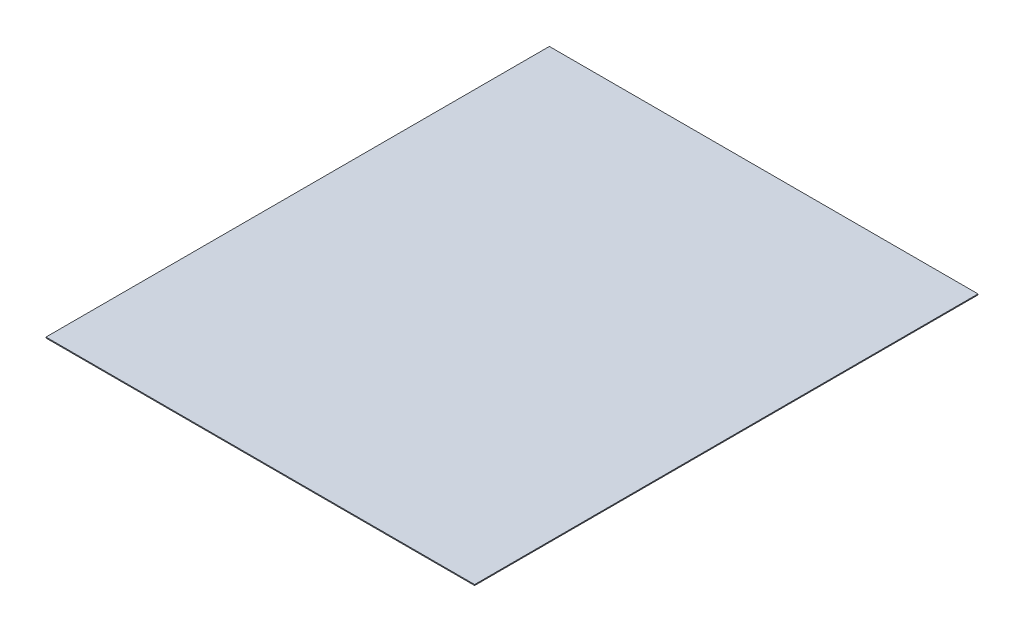
ISO-10303-21;
HEADER;
FILE_DESCRIPTION(('STEP AP214'),'2;1');
FILE_NAME('part.step','',(''),(''),'','','');
FILE_SCHEMA(('AUTOMOTIVE_DESIGN { 1 0 10303 214 1 1 1 1 }'));
ENDSEC;
DATA;
#1=APPLICATION_CONTEXT('core data for automotive mechanical design processes');
#2=APPLICATION_PROTOCOL_DEFINITION('international standard','automotive_design',2000,#1);
#3=PRODUCT_CONTEXT('',#1,'mechanical');
#4=PRODUCT('Part','Part','',(#3));
#5=PRODUCT_RELATED_PRODUCT_CATEGORY('part','',(#4));
#6=PRODUCT_DEFINITION_FORMATION('','',#4);
#7=PRODUCT_DEFINITION_CONTEXT('part definition',#1,'design');
#8=PRODUCT_DEFINITION('design','',#6,#7);
#9=PRODUCT_DEFINITION_SHAPE('','',#8);
#10=(LENGTH_UNIT() NAMED_UNIT(*) SI_UNIT(.MILLI.,.METRE.));
#11=(NAMED_UNIT(*) PLANE_ANGLE_UNIT() SI_UNIT($,.RADIAN.));
#12=(NAMED_UNIT(*) SI_UNIT($,.STERADIAN.) SOLID_ANGLE_UNIT());
#13=UNCERTAINTY_MEASURE_WITH_UNIT(LENGTH_MEASURE(1.E-05),#10,'distance_accuracy_value','');
#14=(GEOMETRIC_REPRESENTATION_CONTEXT(3) GLOBAL_UNCERTAINTY_ASSIGNED_CONTEXT((#13)) GLOBAL_UNIT_ASSIGNED_CONTEXT((#10,
#11,#12)) REPRESENTATION_CONTEXT('',''));
#15=CARTESIAN_POINT('',(0.,0.,0.));
#16=DIRECTION('',(0.,0.,1.));
#17=DIRECTION('',(1.,0.,0.));
#18=AXIS2_PLACEMENT_3D('',#15,#16,#17);
#19=CARTESIAN_POINT('',(1.5,120.,-818.5));
#20=DIRECTION('',(-1.,0.,0.));
#21=DIRECTION('',(0.,0.,1.));
#22=AXIS2_PLACEMENT_3D('',#19,#20,#21);
#23=PLANE('',#22);
#24=DIRECTION('',(0.,-1.,0.));
#25=VECTOR('',#24,1.);
#26=CARTESIAN_POINT('',(1.5,120.,0.));
#27=LINE('',#26,#25);
#28=CARTESIAN_POINT('',(1.5,121.5,0.));
#29=VERTEX_POINT('',#28);
#30=CARTESIAN_POINT('',(1.5,120.,0.));
#31=VERTEX_POINT('',#30);
#32=EDGE_CURVE('E103',#29,#31,#27,.T.);
#33=ORIENTED_EDGE('',*,*,#32,.F.);
#34=DIRECTION('',(0.,0.,1.));
#35=VECTOR('',#34,1.);
#36=CARTESIAN_POINT('',(1.5,121.5,-818.5));
#37=LINE('',#36,#35);
#38=CARTESIAN_POINT('',(1.5,121.5,-818.5));
#39=VERTEX_POINT('',#38);
#40=EDGE_CURVE('E11',#39,#29,#37,.T.);
#41=ORIENTED_EDGE('',*,*,#40,.F.);
#42=DIRECTION('',(0.,-1.,0.));
#43=VECTOR('',#42,1.);
#44=CARTESIAN_POINT('',(1.5,120.,-818.5));
#45=LINE('',#44,#43);
#46=CARTESIAN_POINT('',(1.5,120.,-818.5));
#47=VERTEX_POINT('',#46);
#48=EDGE_CURVE('E97',#39,#47,#45,.T.);
#49=ORIENTED_EDGE('',*,*,#48,.T.);
#50=DIRECTION('',(0.,0.,1.));
#51=VECTOR('',#50,1.);
#52=CARTESIAN_POINT('',(1.5,120.,-818.5));
#53=LINE('',#52,#51);
#54=EDGE_CURVE('E42',#47,#31,#53,.T.);
#55=ORIENTED_EDGE('',*,*,#54,.T.);
#56=EDGE_LOOP('',(#33,#41,#49,#55));
#57=FACE_BOUND('',#56,.T.);
#58=ADVANCED_FACE('F39',(#57),#23,.T.);
#59=CARTESIAN_POINT('',(1.5,121.5,-818.5));
#60=DIRECTION('',(0.,1.,0.));
#61=DIRECTION('',(0.,0.,1.));
#62=AXIS2_PLACEMENT_3D('',#59,#60,#61);
#63=PLANE('',#62);
#64=DIRECTION('',(-1.,0.,0.));
#65=VECTOR('',#64,1.);
#66=CARTESIAN_POINT('',(1.5,121.5,0.));
#67=LINE('',#66,#65);
#68=CARTESIAN_POINT('',(698.5,121.5,0.));
#69=VERTEX_POINT('',#68);
#70=EDGE_CURVE('E99',#69,#29,#67,.T.);
#71=ORIENTED_EDGE('',*,*,#70,.F.);
#72=DIRECTION('',(0.,0.,1.));
#73=VECTOR('',#72,1.);
#74=CARTESIAN_POINT('',(698.5,121.5,-818.5));
#75=LINE('',#74,#73);
#76=CARTESIAN_POINT('',(698.5,121.5,-818.5));
#77=VERTEX_POINT('',#76);
#78=EDGE_CURVE('E48',#77,#69,#75,.T.);
#79=ORIENTED_EDGE('',*,*,#78,.F.);
#80=DIRECTION('',(-1.,0.,0.));
#81=VECTOR('',#80,1.);
#82=CARTESIAN_POINT('',(1.5,121.5,-818.5));
#83=LINE('',#82,#81);
#84=EDGE_CURVE('E94',#77,#39,#83,.T.);
#85=ORIENTED_EDGE('',*,*,#84,.T.);
#86=ORIENTED_EDGE('',*,*,#40,.T.);
#87=EDGE_LOOP('',(#71,#79,#85,#86));
#88=FACE_BOUND('',#87,.T.);
#89=ADVANCED_FACE('F113',(#88),#63,.T.);
#90=CARTESIAN_POINT('',(698.5,120.,-818.5));
#91=DIRECTION('',(1.,0.,0.));
#92=DIRECTION('',(0.,0.,-1.));
#93=AXIS2_PLACEMENT_3D('',#90,#91,#92);
#94=PLANE('',#93);
#95=DIRECTION('',(0.,1.,0.));
#96=VECTOR('',#95,1.);
#97=CARTESIAN_POINT('',(698.5,120.,0.));
#98=LINE('',#97,#96);
#99=CARTESIAN_POINT('',(698.5,120.,0.));
#100=VERTEX_POINT('',#99);
#101=EDGE_CURVE('E89',#100,#69,#98,.T.);
#102=ORIENTED_EDGE('',*,*,#101,.F.);
#103=DIRECTION('',(0.,0.,1.));
#104=VECTOR('',#103,1.);
#105=CARTESIAN_POINT('',(698.5,120.,-818.5));
#106=LINE('',#105,#104);
#107=CARTESIAN_POINT('',(698.5,120.,-818.5));
#108=VERTEX_POINT('',#107);
#109=EDGE_CURVE('E84',#108,#100,#106,.T.);
#110=ORIENTED_EDGE('',*,*,#109,.F.);
#111=DIRECTION('',(0.,1.,0.));
#112=VECTOR('',#111,1.);
#113=CARTESIAN_POINT('',(698.5,120.,-818.5));
#114=LINE('',#113,#112);
#115=EDGE_CURVE('E87',#108,#77,#114,.T.);
#116=ORIENTED_EDGE('',*,*,#115,.T.);
#117=ORIENTED_EDGE('',*,*,#78,.T.);
#118=EDGE_LOOP('',(#102,#110,#116,#117));
#119=FACE_BOUND('',#118,.T.);
#120=ADVANCED_FACE('F86',(#119),#94,.T.);
#121=CARTESIAN_POINT('',(1.5,120.,-818.5));
#122=DIRECTION('',(0.,-1.,0.));
#123=DIRECTION('',(0.,0.,-1.));
#124=AXIS2_PLACEMENT_3D('',#121,#122,#123);
#125=PLANE('',#124);
#126=DIRECTION('',(1.,0.,0.));
#127=VECTOR('',#126,1.);
#128=CARTESIAN_POINT('',(1.5,120.,0.));
#129=LINE('',#128,#127);
#130=EDGE_CURVE('E106',#31,#100,#129,.T.);
#131=ORIENTED_EDGE('',*,*,#130,.F.);
#132=ORIENTED_EDGE('',*,*,#54,.F.);
#133=DIRECTION('',(1.,0.,0.));
#134=VECTOR('',#133,1.);
#135=CARTESIAN_POINT('',(1.5,120.,-818.5));
#136=LINE('',#135,#134);
#137=EDGE_CURVE('E93',#47,#108,#136,.T.);
#138=ORIENTED_EDGE('',*,*,#137,.T.);
#139=ORIENTED_EDGE('',*,*,#109,.T.);
#140=EDGE_LOOP('',(#131,#132,#138,#139));
#141=FACE_BOUND('',#140,.T.);
#142=ADVANCED_FACE('F96',(#141),#125,.T.);
#143=CARTESIAN_POINT('',(0.,0.,-818.5));
#144=DIRECTION('',(0.,0.,-1.));
#145=DIRECTION('',(-1.,0.,0.));
#146=AXIS2_PLACEMENT_3D('',#143,#144,#145);
#147=PLANE('',#146);
#148=ORIENTED_EDGE('',*,*,#48,.F.);
#149=ORIENTED_EDGE('',*,*,#84,.F.);
#150=ORIENTED_EDGE('',*,*,#115,.F.);
#151=ORIENTED_EDGE('',*,*,#137,.F.);
#152=EDGE_LOOP('',(#148,#149,#150,#151));
#153=FACE_BOUND('',#152,.T.);
#154=ADVANCED_FACE('F92',(#153),#147,.T.);
#155=CARTESIAN_POINT('',(0.,0.,0.));
#156=DIRECTION('',(0.,0.,-1.));
#157=DIRECTION('',(-1.,0.,0.));
#158=AXIS2_PLACEMENT_3D('',#155,#156,#157);
#159=PLANE('',#158);
#160=ORIENTED_EDGE('',*,*,#32,.T.);
#161=ORIENTED_EDGE('',*,*,#130,.T.);
#162=ORIENTED_EDGE('',*,*,#101,.T.);
#163=ORIENTED_EDGE('',*,*,#70,.T.);
#164=EDGE_LOOP('',(#160,#161,#162,#163));
#165=FACE_BOUND('',#164,.T.);
#166=ADVANCED_FACE('F112',(#165),#159,.F.);
#167=CLOSED_SHELL('',(#58,#89,#120,#142,#154,#166));
#168=MANIFOLD_SOLID_BREP('B2',#167);
#169=ADVANCED_BREP_SHAPE_REPRESENTATION('',(#18,#168),#14);
#170=SHAPE_DEFINITION_REPRESENTATION(#9,#169);
ENDSEC;
END-ISO-10303-21;
